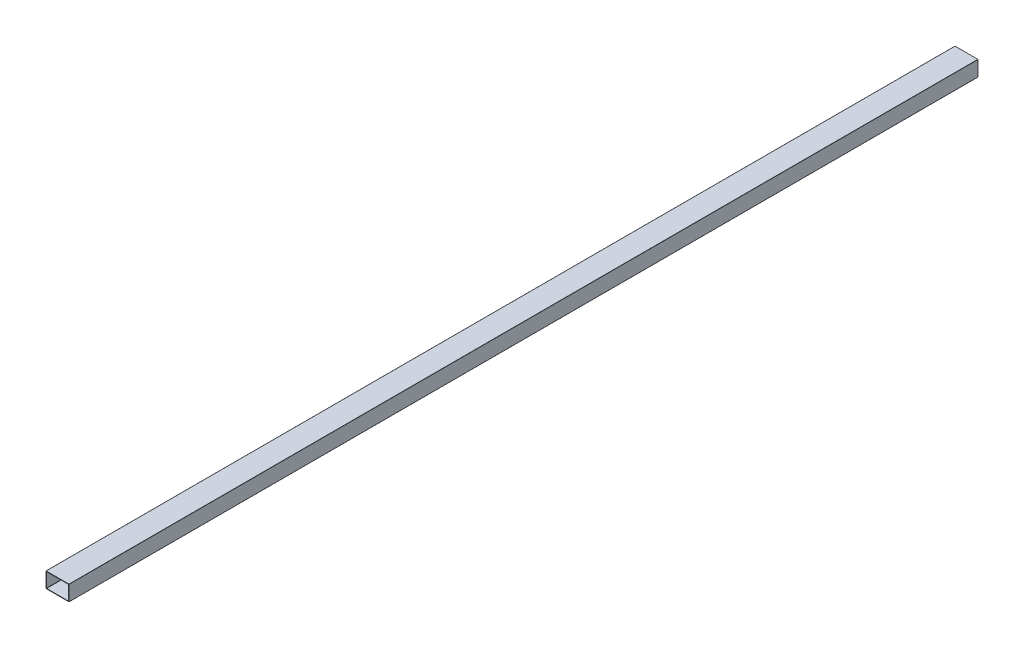
ISO-10303-21;
HEADER;
FILE_DESCRIPTION(('STEP AP214'),'2;1');
FILE_NAME('part.step','',(''),(''),'','','');
FILE_SCHEMA(('AUTOMOTIVE_DESIGN { 1 0 10303 214 1 1 1 1 }'));
ENDSEC;
DATA;
#1=APPLICATION_CONTEXT('core data for automotive mechanical design processes');
#2=APPLICATION_PROTOCOL_DEFINITION('international standard','automotive_design',2000,#1);
#3=PRODUCT_CONTEXT('',#1,'mechanical');
#4=PRODUCT('Part','Part','',(#3));
#5=PRODUCT_RELATED_PRODUCT_CATEGORY('part','',(#4));
#6=PRODUCT_DEFINITION_FORMATION('','',#4);
#7=PRODUCT_DEFINITION_CONTEXT('part definition',#1,'design');
#8=PRODUCT_DEFINITION('design','',#6,#7);
#9=PRODUCT_DEFINITION_SHAPE('','',#8);
#10=(LENGTH_UNIT() NAMED_UNIT(*) SI_UNIT(.MILLI.,.METRE.));
#11=(NAMED_UNIT(*) PLANE_ANGLE_UNIT() SI_UNIT($,.RADIAN.));
#12=(NAMED_UNIT(*) SI_UNIT($,.STERADIAN.) SOLID_ANGLE_UNIT());
#13=UNCERTAINTY_MEASURE_WITH_UNIT(LENGTH_MEASURE(1.E-05),#10,'distance_accuracy_value','');
#14=(GEOMETRIC_REPRESENTATION_CONTEXT(3) GLOBAL_UNCERTAINTY_ASSIGNED_CONTEXT((#13)) GLOBAL_UNIT_ASSIGNED_CONTEXT((#10,
#11,#12)) REPRESENTATION_CONTEXT('',''));
#15=CARTESIAN_POINT('',(0.,0.,0.));
#16=DIRECTION('',(0.,0.,1.));
#17=DIRECTION('',(1.,0.,0.));
#18=AXIS2_PLACEMENT_3D('',#15,#16,#17);
#19=CARTESIAN_POINT('',(76.2,-50.8,-6000.));
#20=DIRECTION('',(1.,0.,0.));
#21=DIRECTION('',(0.,0.,-1.));
#22=AXIS2_PLACEMENT_3D('',#19,#20,#21);
#23=PLANE('',#22);
#24=DIRECTION('',(0.,1.,0.));
#25=VECTOR('',#24,1.);
#26=CARTESIAN_POINT('',(76.2,-50.8,0.));
#27=LINE('',#26,#25);
#28=CARTESIAN_POINT('',(76.2,-49.8,0.));
#29=VERTEX_POINT('',#28);
#30=CARTESIAN_POINT('',(76.2,49.8,0.));
#31=VERTEX_POINT('',#30);
#32=EDGE_CURVE('E197',#29,#31,#27,.T.);
#33=ORIENTED_EDGE('',*,*,#32,.F.);
#34=DIRECTION('',(0.,0.,1.));
#35=VECTOR('',#34,1.);
#36=CARTESIAN_POINT('',(76.2,-49.8,-6000.));
#37=LINE('',#36,#35);
#38=CARTESIAN_POINT('',(76.2,-49.8,-6000.));
#39=VERTEX_POINT('',#38);
#40=EDGE_CURVE('E158',#29,#39,#37,.F.);
#41=ORIENTED_EDGE('',*,*,#40,.T.);
#42=DIRECTION('',(0.,1.,0.));
#43=VECTOR('',#42,1.);
#44=CARTESIAN_POINT('',(76.2,-50.8,-6000.));
#45=LINE('',#44,#43);
#46=CARTESIAN_POINT('',(76.2,49.8,-6000.));
#47=VERTEX_POINT('',#46);
#48=EDGE_CURVE('E185',#39,#47,#45,.T.);
#49=ORIENTED_EDGE('',*,*,#48,.T.);
#50=DIRECTION('',(0.,0.,1.));
#51=VECTOR('',#50,1.);
#52=CARTESIAN_POINT('',(76.2,49.8,-6000.));
#53=LINE('',#52,#51);
#54=EDGE_CURVE('E251',#47,#31,#53,.T.);
#55=ORIENTED_EDGE('',*,*,#54,.T.);
#56=EDGE_LOOP('',(#33,#41,#49,#55));
#57=FACE_BOUND('',#56,.T.);
#58=ADVANCED_FACE('F33',(#57),#23,.T.);
#59=CARTESIAN_POINT('',(-76.2,-50.8,-6000.));
#60=DIRECTION('',(0.,-1.,0.));
#61=DIRECTION('',(0.,0.,-1.));
#62=AXIS2_PLACEMENT_3D('',#59,#60,#61);
#63=PLANE('',#62);
#64=DIRECTION('',(1.,0.,0.));
#65=VECTOR('',#64,1.);
#66=CARTESIAN_POINT('',(-76.2,-50.8,0.));
#67=LINE('',#66,#65);
#68=CARTESIAN_POINT('',(-75.2,-50.8,0.));
#69=VERTEX_POINT('',#68);
#70=CARTESIAN_POINT('',(75.2,-50.8,0.));
#71=VERTEX_POINT('',#70);
#72=EDGE_CURVE('E189',#69,#71,#67,.T.);
#73=ORIENTED_EDGE('',*,*,#72,.F.);
#74=DIRECTION('',(0.,0.,1.));
#75=VECTOR('',#74,1.);
#76=CARTESIAN_POINT('',(-75.2,-50.8,-6000.));
#77=LINE('',#76,#75);
#78=CARTESIAN_POINT('',(-75.2,-50.8,-6000.));
#79=VERTEX_POINT('',#78);
#80=EDGE_CURVE('E238',#69,#79,#77,.F.);
#81=ORIENTED_EDGE('',*,*,#80,.T.);
#82=DIRECTION('',(1.,0.,0.));
#83=VECTOR('',#82,1.);
#84=CARTESIAN_POINT('',(-76.2,-50.8,-6000.));
#85=LINE('',#84,#83);
#86=CARTESIAN_POINT('',(75.2,-50.8,-6000.));
#87=VERTEX_POINT('',#86);
#88=EDGE_CURVE('E194',#79,#87,#85,.T.);
#89=ORIENTED_EDGE('',*,*,#88,.T.);
#90=DIRECTION('',(0.,0.,1.));
#91=VECTOR('',#90,1.);
#92=CARTESIAN_POINT('',(75.2,-50.8,-6000.));
#93=LINE('',#92,#91);
#94=EDGE_CURVE('E235',#87,#71,#93,.T.);
#95=ORIENTED_EDGE('',*,*,#94,.T.);
#96=EDGE_LOOP('',(#73,#81,#89,#95));
#97=FACE_BOUND('',#96,.T.);
#98=ADVANCED_FACE('F305',(#97),#63,.T.);
#99=CARTESIAN_POINT('',(-76.2,-50.8,-6000.));
#100=DIRECTION('',(-1.,0.,0.));
#101=DIRECTION('',(0.,0.,1.));
#102=AXIS2_PLACEMENT_3D('',#99,#100,#101);
#103=PLANE('',#102);
#104=DIRECTION('',(0.,-1.,0.));
#105=VECTOR('',#104,1.);
#106=CARTESIAN_POINT('',(-76.2,-50.8,-6000.));
#107=LINE('',#106,#105);
#108=CARTESIAN_POINT('',(-76.2,49.8,-6000.));
#109=VERTEX_POINT('',#108);
#110=CARTESIAN_POINT('',(-76.2,-49.8,-6000.));
#111=VERTEX_POINT('',#110);
#112=EDGE_CURVE('E191',#109,#111,#107,.T.);
#113=ORIENTED_EDGE('',*,*,#112,.T.);
#114=DIRECTION('',(0.,0.,1.));
#115=VECTOR('',#114,1.);
#116=CARTESIAN_POINT('',(-76.2,-49.8,-6000.));
#117=LINE('',#116,#115);
#118=CARTESIAN_POINT('',(-76.2,-49.8,0.));
#119=VERTEX_POINT('',#118);
#120=EDGE_CURVE('E224',#111,#119,#117,.T.);
#121=ORIENTED_EDGE('',*,*,#120,.T.);
#122=DIRECTION('',(0.,-1.,0.));
#123=VECTOR('',#122,1.);
#124=CARTESIAN_POINT('',(-76.2,-50.8,0.));
#125=LINE('',#124,#123);
#126=CARTESIAN_POINT('',(-76.2,49.8,0.));
#127=VERTEX_POINT('',#126);
#128=EDGE_CURVE('E203',#127,#119,#125,.T.);
#129=ORIENTED_EDGE('',*,*,#128,.F.);
#130=DIRECTION('',(0.,0.,1.));
#131=VECTOR('',#130,1.);
#132=CARTESIAN_POINT('',(-76.2,49.8,-6000.));
#133=LINE('',#132,#131);
#134=EDGE_CURVE('E222',#127,#109,#133,.F.);
#135=ORIENTED_EDGE('',*,*,#134,.T.);
#136=EDGE_LOOP('',(#113,#121,#129,#135));
#137=FACE_BOUND('',#136,.T.);
#138=ADVANCED_FACE('F311',(#137),#103,.T.);
#139=CARTESIAN_POINT('',(-76.2,50.8,-6000.));
#140=DIRECTION('',(0.,1.,0.));
#141=DIRECTION('',(0.,0.,1.));
#142=AXIS2_PLACEMENT_3D('',#139,#140,#141);
#143=PLANE('',#142);
#144=DIRECTION('',(-1.,0.,0.));
#145=VECTOR('',#144,1.);
#146=CARTESIAN_POINT('',(-76.2,50.8,-6000.));
#147=LINE('',#146,#145);
#148=CARTESIAN_POINT('',(75.2,50.8,-6000.));
#149=VERTEX_POINT('',#148);
#150=CARTESIAN_POINT('',(-75.2,50.8,-6000.));
#151=VERTEX_POINT('',#150);
#152=EDGE_CURVE('E188',#149,#151,#147,.T.);
#153=ORIENTED_EDGE('',*,*,#152,.T.);
#154=DIRECTION('',(0.,0.,1.));
#155=VECTOR('',#154,1.);
#156=CARTESIAN_POINT('',(-75.2,50.8,-6000.));
#157=LINE('',#156,#155);
#158=CARTESIAN_POINT('',(-75.2,50.8,0.));
#159=VERTEX_POINT('',#158);
#160=EDGE_CURVE('E248',#151,#159,#157,.T.);
#161=ORIENTED_EDGE('',*,*,#160,.T.);
#162=DIRECTION('',(-1.,0.,0.));
#163=VECTOR('',#162,1.);
#164=CARTESIAN_POINT('',(-76.2,50.8,0.));
#165=LINE('',#164,#163);
#166=CARTESIAN_POINT('',(75.2,50.8,0.));
#167=VERTEX_POINT('',#166);
#168=EDGE_CURVE('E200',#167,#159,#165,.T.);
#169=ORIENTED_EDGE('',*,*,#168,.F.);
#170=DIRECTION('',(0.,0.,1.));
#171=VECTOR('',#170,1.);
#172=CARTESIAN_POINT('',(75.2,50.8,-6000.));
#173=LINE('',#172,#171);
#174=EDGE_CURVE('E55',#167,#149,#173,.F.);
#175=ORIENTED_EDGE('',*,*,#174,.T.);
#176=EDGE_LOOP('',(#153,#161,#169,#175));
#177=FACE_BOUND('',#176,.T.);
#178=ADVANCED_FACE('F316',(#177),#143,.T.);
#179=CARTESIAN_POINT('',(0.,0.,-6000.));
#180=DIRECTION('',(0.,0.,-1.));
#181=DIRECTION('',(-1.,0.,0.));
#182=AXIS2_PLACEMENT_3D('',#179,#180,#181);
#183=PLANE('',#182);
#184=DIRECTION('',(0.,-1.,0.));
#185=VECTOR('',#184,1.);
#186=CARTESIAN_POINT('',(-73.16,-47.76,-6000.));
#187=LINE('',#186,#185);
#188=CARTESIAN_POINT('',(-73.16,46.76,-6000.));
#189=VERTEX_POINT('',#188);
#190=CARTESIAN_POINT('',(-73.16,-46.76,-6000.));
#191=VERTEX_POINT('',#190);
#192=EDGE_CURVE('E167',#189,#191,#187,.T.);
#193=ORIENTED_EDGE('',*,*,#192,.T.);
#194=CARTESIAN_POINT('',(-72.16,-46.76,-6000.));
#195=DIRECTION('',(0.,0.,-1.));
#196=DIRECTION('',(-1.,0.,0.));
#197=AXIS2_PLACEMENT_3D('',#194,#195,#196);
#198=CIRCLE('',#197,1.);
#199=CARTESIAN_POINT('',(-72.16,-47.76,-6000.));
#200=VERTEX_POINT('',#199);
#201=EDGE_CURVE('E11',#191,#200,#198,.F.);
#202=ORIENTED_EDGE('',*,*,#201,.T.);
#203=DIRECTION('',(1.,0.,0.));
#204=VECTOR('',#203,1.);
#205=CARTESIAN_POINT('',(-73.16,-47.76,-6000.));
#206=LINE('',#205,#204);
#207=CARTESIAN_POINT('',(72.16,-47.76,-6000.));
#208=VERTEX_POINT('',#207);
#209=EDGE_CURVE('E175',#200,#208,#206,.T.);
#210=ORIENTED_EDGE('',*,*,#209,.T.);
#211=CARTESIAN_POINT('',(72.16,-46.76,-6000.));
#212=DIRECTION('',(0.,0.,-1.));
#213=DIRECTION('',(-1.,0.,0.));
#214=AXIS2_PLACEMENT_3D('',#211,#212,#213);
#215=CIRCLE('',#214,1.);
#216=CARTESIAN_POINT('',(73.16,-46.76,-6000.));
#217=VERTEX_POINT('',#216);
#218=EDGE_CURVE('E262',#208,#217,#215,.F.);
#219=ORIENTED_EDGE('',*,*,#218,.T.);
#220=DIRECTION('',(0.,1.,0.));
#221=VECTOR('',#220,1.);
#222=CARTESIAN_POINT('',(73.16,-47.76,-6000.));
#223=LINE('',#222,#221);
#224=CARTESIAN_POINT('',(73.16,46.76,-6000.));
#225=VERTEX_POINT('',#224);
#226=EDGE_CURVE('E179',#217,#225,#223,.T.);
#227=ORIENTED_EDGE('',*,*,#226,.T.);
#228=CARTESIAN_POINT('',(72.16,46.76,-6000.));
#229=DIRECTION('',(0.,0.,-1.));
#230=DIRECTION('',(-1.,0.,0.));
#231=AXIS2_PLACEMENT_3D('',#228,#229,#230);
#232=CIRCLE('',#231,1.);
#233=CARTESIAN_POINT('',(72.16,47.76,-6000.));
#234=VERTEX_POINT('',#233);
#235=EDGE_CURVE('E258',#225,#234,#232,.F.);
#236=ORIENTED_EDGE('',*,*,#235,.T.);
#237=DIRECTION('',(-1.,0.,0.));
#238=VECTOR('',#237,1.);
#239=CARTESIAN_POINT('',(-73.16,47.76,-6000.));
#240=LINE('',#239,#238);
#241=CARTESIAN_POINT('',(-72.16,47.76,-6000.));
#242=VERTEX_POINT('',#241);
#243=EDGE_CURVE('E277',#234,#242,#240,.T.);
#244=ORIENTED_EDGE('',*,*,#243,.T.);
#245=CARTESIAN_POINT('',(-72.16,46.76,-6000.));
#246=DIRECTION('',(0.,0.,-1.));
#247=DIRECTION('',(-1.,0.,0.));
#248=AXIS2_PLACEMENT_3D('',#245,#246,#247);
#249=CIRCLE('',#248,1.);
#250=EDGE_CURVE('E157',#242,#189,#249,.F.);
#251=ORIENTED_EDGE('',*,*,#250,.T.);
#252=EDGE_LOOP('',(#193,#202,#210,#219,#227,#236,#244,#251));
#253=FACE_BOUND('',#252,.T.);
#254=ORIENTED_EDGE('',*,*,#88,.F.);
#255=CARTESIAN_POINT('',(-75.2,-49.8,-6000.));
#256=DIRECTION('',(0.,0.,-1.));
#257=DIRECTION('',(-1.,0.,0.));
#258=AXIS2_PLACEMENT_3D('',#255,#256,#257);
#259=CIRCLE('',#258,1.);
#260=EDGE_CURVE('E245',#79,#111,#259,.T.);
#261=ORIENTED_EDGE('',*,*,#260,.T.);
#262=ORIENTED_EDGE('',*,*,#112,.F.);
#263=CARTESIAN_POINT('',(-75.2,49.8,-6000.));
#264=DIRECTION('',(0.,0.,-1.));
#265=DIRECTION('',(-1.,0.,0.));
#266=AXIS2_PLACEMENT_3D('',#263,#264,#265);
#267=CIRCLE('',#266,1.);
#268=EDGE_CURVE('E48',#109,#151,#267,.T.);
#269=ORIENTED_EDGE('',*,*,#268,.T.);
#270=ORIENTED_EDGE('',*,*,#152,.F.);
#271=CARTESIAN_POINT('',(75.2,49.8,-6000.));
#272=DIRECTION('',(0.,0.,-1.));
#273=DIRECTION('',(-1.,0.,0.));
#274=AXIS2_PLACEMENT_3D('',#271,#272,#273);
#275=CIRCLE('',#274,1.);
#276=EDGE_CURVE('E240',#149,#47,#275,.T.);
#277=ORIENTED_EDGE('',*,*,#276,.T.);
#278=ORIENTED_EDGE('',*,*,#48,.F.);
#279=CARTESIAN_POINT('',(75.2,-49.8,-6000.));
#280=DIRECTION('',(0.,0.,-1.));
#281=DIRECTION('',(-1.,0.,0.));
#282=AXIS2_PLACEMENT_3D('',#279,#280,#281);
#283=CIRCLE('',#282,1.);
#284=EDGE_CURVE('E242',#39,#87,#283,.T.);
#285=ORIENTED_EDGE('',*,*,#284,.T.);
#286=EDGE_LOOP('',(#254,#261,#262,#269,#270,#277,#278,#285));
#287=FACE_BOUND('',#286,.T.);
#288=ADVANCED_FACE('F267',(#253,#287),#183,.T.);
#289=CARTESIAN_POINT('',(0.,0.,0.));
#290=DIRECTION('',(0.,0.,-1.));
#291=DIRECTION('',(-1.,0.,0.));
#292=AXIS2_PLACEMENT_3D('',#289,#290,#291);
#293=PLANE('',#292);
#294=DIRECTION('',(0.,1.,0.));
#295=VECTOR('',#294,1.);
#296=CARTESIAN_POINT('',(73.16,-47.76,0.));
#297=LINE('',#296,#295);
#298=CARTESIAN_POINT('',(73.16,-46.76,0.));
#299=VERTEX_POINT('',#298);
#300=CARTESIAN_POINT('',(73.16,46.76,0.));
#301=VERTEX_POINT('',#300);
#302=EDGE_CURVE('E181',#299,#301,#297,.T.);
#303=ORIENTED_EDGE('',*,*,#302,.F.);
#304=CARTESIAN_POINT('',(72.16,-46.76,0.));
#305=DIRECTION('',(0.,0.,-1.));
#306=DIRECTION('',(-1.,0.,0.));
#307=AXIS2_PLACEMENT_3D('',#304,#305,#306);
#308=CIRCLE('',#307,1.);
#309=CARTESIAN_POINT('',(72.16,-47.76,0.));
#310=VERTEX_POINT('',#309);
#311=EDGE_CURVE('E260',#299,#310,#308,.T.);
#312=ORIENTED_EDGE('',*,*,#311,.T.);
#313=DIRECTION('',(1.,0.,0.));
#314=VECTOR('',#313,1.);
#315=CARTESIAN_POINT('',(-73.16,-47.76,0.));
#316=LINE('',#315,#314);
#317=CARTESIAN_POINT('',(-72.16,-47.76,0.));
#318=VERTEX_POINT('',#317);
#319=EDGE_CURVE('E281',#318,#310,#316,.T.);
#320=ORIENTED_EDGE('',*,*,#319,.F.);
#321=CARTESIAN_POINT('',(-72.16,-46.76,0.));
#322=DIRECTION('',(0.,0.,-1.));
#323=DIRECTION('',(-1.,0.,0.));
#324=AXIS2_PLACEMENT_3D('',#321,#322,#323);
#325=CIRCLE('',#324,1.);
#326=CARTESIAN_POINT('',(-73.16,-46.76,0.));
#327=VERTEX_POINT('',#326);
#328=EDGE_CURVE('E41',#318,#327,#325,.T.);
#329=ORIENTED_EDGE('',*,*,#328,.T.);
#330=DIRECTION('',(0.,-1.,0.));
#331=VECTOR('',#330,1.);
#332=CARTESIAN_POINT('',(-73.16,-47.76,0.));
#333=LINE('',#332,#331);
#334=CARTESIAN_POINT('',(-73.16,46.76,0.));
#335=VERTEX_POINT('',#334);
#336=EDGE_CURVE('E164',#335,#327,#333,.T.);
#337=ORIENTED_EDGE('',*,*,#336,.F.);
#338=CARTESIAN_POINT('',(-72.16,46.76,0.));
#339=DIRECTION('',(0.,0.,-1.));
#340=DIRECTION('',(-1.,0.,0.));
#341=AXIS2_PLACEMENT_3D('',#338,#339,#340);
#342=CIRCLE('',#341,1.);
#343=CARTESIAN_POINT('',(-72.16,47.76,0.));
#344=VERTEX_POINT('',#343);
#345=EDGE_CURVE('E147',#335,#344,#342,.T.);
#346=ORIENTED_EDGE('',*,*,#345,.T.);
#347=DIRECTION('',(-1.,0.,0.));
#348=VECTOR('',#347,1.);
#349=CARTESIAN_POINT('',(-73.16,47.76,0.));
#350=LINE('',#349,#348);
#351=CARTESIAN_POINT('',(72.16,47.76,0.));
#352=VERTEX_POINT('',#351);
#353=EDGE_CURVE('E176',#352,#344,#350,.T.);
#354=ORIENTED_EDGE('',*,*,#353,.F.);
#355=CARTESIAN_POINT('',(72.16,46.76,0.));
#356=DIRECTION('',(0.,0.,-1.));
#357=DIRECTION('',(-1.,0.,0.));
#358=AXIS2_PLACEMENT_3D('',#355,#356,#357);
#359=CIRCLE('',#358,1.);
#360=EDGE_CURVE('E256',#352,#301,#359,.T.);
#361=ORIENTED_EDGE('',*,*,#360,.T.);
#362=EDGE_LOOP('',(#303,#312,#320,#329,#337,#346,#354,#361));
#363=FACE_BOUND('',#362,.T.);
#364=ORIENTED_EDGE('',*,*,#128,.T.);
#365=CARTESIAN_POINT('',(-75.2,-49.8,0.));
#366=DIRECTION('',(0.,0.,-1.));
#367=DIRECTION('',(-1.,0.,0.));
#368=AXIS2_PLACEMENT_3D('',#365,#366,#367);
#369=CIRCLE('',#368,1.);
#370=EDGE_CURVE('E233',#119,#69,#369,.F.);
#371=ORIENTED_EDGE('',*,*,#370,.T.);
#372=ORIENTED_EDGE('',*,*,#72,.T.);
#373=CARTESIAN_POINT('',(75.2,-49.8,0.));
#374=DIRECTION('',(0.,0.,-1.));
#375=DIRECTION('',(-1.,0.,0.));
#376=AXIS2_PLACEMENT_3D('',#373,#374,#375);
#377=CIRCLE('',#376,1.);
#378=EDGE_CURVE('E229',#71,#29,#377,.F.);
#379=ORIENTED_EDGE('',*,*,#378,.T.);
#380=ORIENTED_EDGE('',*,*,#32,.T.);
#381=CARTESIAN_POINT('',(75.2,49.8,0.));
#382=DIRECTION('',(0.,0.,-1.));
#383=DIRECTION('',(-1.,0.,0.));
#384=AXIS2_PLACEMENT_3D('',#381,#382,#383);
#385=CIRCLE('',#384,1.);
#386=EDGE_CURVE('E227',#31,#167,#385,.F.);
#387=ORIENTED_EDGE('',*,*,#386,.T.);
#388=ORIENTED_EDGE('',*,*,#168,.T.);
#389=CARTESIAN_POINT('',(-75.2,49.8,0.));
#390=DIRECTION('',(0.,0.,-1.));
#391=DIRECTION('',(-1.,0.,0.));
#392=AXIS2_PLACEMENT_3D('',#389,#390,#391);
#393=CIRCLE('',#392,1.);
#394=EDGE_CURVE('E231',#159,#127,#393,.F.);
#395=ORIENTED_EDGE('',*,*,#394,.T.);
#396=EDGE_LOOP('',(#364,#371,#372,#379,#380,#387,#388,#395));
#397=FACE_BOUND('',#396,.T.);
#398=ADVANCED_FACE('F172',(#363,#397),#293,.F.);
#399=CARTESIAN_POINT('',(-73.16,-47.76,-6000.));
#400=DIRECTION('',(0.,-1.,0.));
#401=DIRECTION('',(0.,0.,-1.));
#402=AXIS2_PLACEMENT_3D('',#399,#400,#401);
#403=PLANE('',#402);
#404=ORIENTED_EDGE('',*,*,#319,.T.);
#405=DIRECTION('',(0.,0.,1.));
#406=VECTOR('',#405,1.);
#407=CARTESIAN_POINT('',(72.16,-47.76,-6000.));
#408=LINE('',#407,#406);
#409=EDGE_CURVE('E220',#310,#208,#408,.F.);
#410=ORIENTED_EDGE('',*,*,#409,.T.);
#411=ORIENTED_EDGE('',*,*,#209,.F.);
#412=DIRECTION('',(0.,0.,1.));
#413=VECTOR('',#412,1.);
#414=CARTESIAN_POINT('',(-72.16,-47.76,0.));
#415=LINE('',#414,#413);
#416=EDGE_CURVE('E217',#200,#318,#415,.T.);
#417=ORIENTED_EDGE('',*,*,#416,.T.);
#418=EDGE_LOOP('',(#404,#410,#411,#417));
#419=FACE_BOUND('',#418,.T.);
#420=ADVANCED_FACE('F283',(#419),#403,.F.);
#421=CARTESIAN_POINT('',(-73.16,-47.76,-6000.));
#422=DIRECTION('',(-1.,0.,0.));
#423=DIRECTION('',(0.,0.,1.));
#424=AXIS2_PLACEMENT_3D('',#421,#422,#423);
#425=PLANE('',#424);
#426=ORIENTED_EDGE('',*,*,#192,.F.);
#427=DIRECTION('',(0.,0.,1.));
#428=VECTOR('',#427,1.);
#429=CARTESIAN_POINT('',(-73.16,46.76,0.));
#430=LINE('',#429,#428);
#431=EDGE_CURVE('E151',#189,#335,#430,.T.);
#432=ORIENTED_EDGE('',*,*,#431,.T.);
#433=ORIENTED_EDGE('',*,*,#336,.T.);
#434=DIRECTION('',(0.,0.,1.));
#435=VECTOR('',#434,1.);
#436=CARTESIAN_POINT('',(-73.16,-46.76,-6000.));
#437=LINE('',#436,#435);
#438=EDGE_CURVE('E169',#327,#191,#437,.F.);
#439=ORIENTED_EDGE('',*,*,#438,.T.);
#440=EDGE_LOOP('',(#426,#432,#433,#439));
#441=FACE_BOUND('',#440,.T.);
#442=ADVANCED_FACE('F163',(#441),#425,.F.);
#443=CARTESIAN_POINT('',(-73.16,47.76,-6000.));
#444=DIRECTION('',(0.,1.,0.));
#445=DIRECTION('',(-1.,0.,0.));
#446=AXIS2_PLACEMENT_3D('',#443,#444,#445);
#447=PLANE('',#446);
#448=ORIENTED_EDGE('',*,*,#353,.T.);
#449=DIRECTION('',(0.,0.,1.));
#450=VECTOR('',#449,1.);
#451=CARTESIAN_POINT('',(-72.16,47.76,-6000.));
#452=LINE('',#451,#450);
#453=EDGE_CURVE('E152',#344,#242,#452,.F.);
#454=ORIENTED_EDGE('',*,*,#453,.T.);
#455=ORIENTED_EDGE('',*,*,#243,.F.);
#456=DIRECTION('',(0.,0.,1.));
#457=VECTOR('',#456,1.);
#458=CARTESIAN_POINT('',(72.16,47.76,0.));
#459=LINE('',#458,#457);
#460=EDGE_CURVE('E168',#234,#352,#459,.T.);
#461=ORIENTED_EDGE('',*,*,#460,.T.);
#462=EDGE_LOOP('',(#448,#454,#455,#461));
#463=FACE_BOUND('',#462,.T.);
#464=ADVANCED_FACE('F292',(#463),#447,.F.);
#465=CARTESIAN_POINT('',(73.16,-47.76,-6000.));
#466=DIRECTION('',(1.,0.,0.));
#467=DIRECTION('',(0.,1.,0.));
#468=AXIS2_PLACEMENT_3D('',#465,#466,#467);
#469=PLANE('',#468);
#470=ORIENTED_EDGE('',*,*,#302,.T.);
#471=DIRECTION('',(0.,0.,1.));
#472=VECTOR('',#471,1.);
#473=CARTESIAN_POINT('',(73.16,46.76,-6000.));
#474=LINE('',#473,#472);
#475=EDGE_CURVE('E215',#301,#225,#474,.F.);
#476=ORIENTED_EDGE('',*,*,#475,.T.);
#477=ORIENTED_EDGE('',*,*,#226,.F.);
#478=DIRECTION('',(0.,0.,1.));
#479=VECTOR('',#478,1.);
#480=CARTESIAN_POINT('',(73.16,-46.76,0.));
#481=LINE('',#480,#479);
#482=EDGE_CURVE('E212',#217,#299,#481,.T.);
#483=ORIENTED_EDGE('',*,*,#482,.T.);
#484=EDGE_LOOP('',(#470,#476,#477,#483));
#485=FACE_BOUND('',#484,.T.);
#486=ADVANCED_FACE('F275',(#485),#469,.F.);
#487=CARTESIAN_POINT('',(-72.16,46.76,-6000.));
#488=DIRECTION('',(0.,0.,-1.));
#489=DIRECTION('',(-1.,0.,0.));
#490=AXIS2_PLACEMENT_3D('',#487,#488,#489);
#491=CYLINDRICAL_SURFACE('',#490,1.);
#492=ORIENTED_EDGE('',*,*,#250,.F.);
#493=ORIENTED_EDGE('',*,*,#453,.F.);
#494=ORIENTED_EDGE('',*,*,#345,.F.);
#495=ORIENTED_EDGE('',*,*,#431,.F.);
#496=EDGE_LOOP('',(#492,#493,#494,#495));
#497=FACE_BOUND('',#496,.T.);
#498=ADVANCED_FACE('F150',(#497),#491,.F.);
#499=CARTESIAN_POINT('',(72.16,46.76,-6000.));
#500=DIRECTION('',(0.,0.,-1.));
#501=DIRECTION('',(-1.,0.,0.));
#502=AXIS2_PLACEMENT_3D('',#499,#500,#501);
#503=CYLINDRICAL_SURFACE('',#502,1.);
#504=ORIENTED_EDGE('',*,*,#235,.F.);
#505=ORIENTED_EDGE('',*,*,#475,.F.);
#506=ORIENTED_EDGE('',*,*,#360,.F.);
#507=ORIENTED_EDGE('',*,*,#460,.F.);
#508=EDGE_LOOP('',(#504,#505,#506,#507));
#509=FACE_BOUND('',#508,.T.);
#510=ADVANCED_FACE('F294',(#509),#503,.F.);
#511=CARTESIAN_POINT('',(72.16,-46.76,-6000.));
#512=DIRECTION('',(0.,0.,-1.));
#513=DIRECTION('',(-1.,0.,0.));
#514=AXIS2_PLACEMENT_3D('',#511,#512,#513);
#515=CYLINDRICAL_SURFACE('',#514,1.);
#516=ORIENTED_EDGE('',*,*,#218,.F.);
#517=ORIENTED_EDGE('',*,*,#409,.F.);
#518=ORIENTED_EDGE('',*,*,#311,.F.);
#519=ORIENTED_EDGE('',*,*,#482,.F.);
#520=EDGE_LOOP('',(#516,#517,#518,#519));
#521=FACE_BOUND('',#520,.T.);
#522=ADVANCED_FACE('F279',(#521),#515,.F.);
#523=CARTESIAN_POINT('',(-75.2,-49.8,-6000.));
#524=DIRECTION('',(0.,0.,1.));
#525=DIRECTION('',(1.,0.,0.));
#526=AXIS2_PLACEMENT_3D('',#523,#524,#525);
#527=CYLINDRICAL_SURFACE('',#526,1.);
#528=ORIENTED_EDGE('',*,*,#260,.F.);
#529=ORIENTED_EDGE('',*,*,#80,.F.);
#530=ORIENTED_EDGE('',*,*,#370,.F.);
#531=ORIENTED_EDGE('',*,*,#120,.F.);
#532=EDGE_LOOP('',(#528,#529,#530,#531));
#533=FACE_BOUND('',#532,.T.);
#534=ADVANCED_FACE('F301',(#533),#527,.T.);
#535=CARTESIAN_POINT('',(-75.2,49.8,-6000.));
#536=DIRECTION('',(0.,0.,1.));
#537=DIRECTION('',(1.,0.,0.));
#538=AXIS2_PLACEMENT_3D('',#535,#536,#537);
#539=CYLINDRICAL_SURFACE('',#538,1.);
#540=ORIENTED_EDGE('',*,*,#268,.F.);
#541=ORIENTED_EDGE('',*,*,#134,.F.);
#542=ORIENTED_EDGE('',*,*,#394,.F.);
#543=ORIENTED_EDGE('',*,*,#160,.F.);
#544=EDGE_LOOP('',(#540,#541,#542,#543));
#545=FACE_BOUND('',#544,.T.);
#546=ADVANCED_FACE('F368',(#545),#539,.T.);
#547=CARTESIAN_POINT('',(-72.16,-46.76,-6000.));
#548=DIRECTION('',(0.,0.,-1.));
#549=DIRECTION('',(-1.,0.,0.));
#550=AXIS2_PLACEMENT_3D('',#547,#548,#549);
#551=CYLINDRICAL_SURFACE('',#550,1.);
#552=ORIENTED_EDGE('',*,*,#201,.F.);
#553=ORIENTED_EDGE('',*,*,#438,.F.);
#554=ORIENTED_EDGE('',*,*,#328,.F.);
#555=ORIENTED_EDGE('',*,*,#416,.F.);
#556=EDGE_LOOP('',(#552,#553,#554,#555));
#557=FACE_BOUND('',#556,.T.);
#558=ADVANCED_FACE('F378',(#557),#551,.F.);
#559=CARTESIAN_POINT('',(75.2,-49.8,-6000.));
#560=DIRECTION('',(0.,0.,1.));
#561=DIRECTION('',(1.,0.,0.));
#562=AXIS2_PLACEMENT_3D('',#559,#560,#561);
#563=CYLINDRICAL_SURFACE('',#562,1.);
#564=ORIENTED_EDGE('',*,*,#284,.F.);
#565=ORIENTED_EDGE('',*,*,#40,.F.);
#566=ORIENTED_EDGE('',*,*,#378,.F.);
#567=ORIENTED_EDGE('',*,*,#94,.F.);
#568=EDGE_LOOP('',(#564,#565,#566,#567));
#569=FACE_BOUND('',#568,.T.);
#570=ADVANCED_FACE('F388',(#569),#563,.T.);
#571=CARTESIAN_POINT('',(75.2,49.8,-6000.));
#572=DIRECTION('',(0.,0.,1.));
#573=DIRECTION('',(1.,0.,0.));
#574=AXIS2_PLACEMENT_3D('',#571,#572,#573);
#575=CYLINDRICAL_SURFACE('',#574,1.);
#576=ORIENTED_EDGE('',*,*,#276,.F.);
#577=ORIENTED_EDGE('',*,*,#174,.F.);
#578=ORIENTED_EDGE('',*,*,#386,.F.);
#579=ORIENTED_EDGE('',*,*,#54,.F.);
#580=EDGE_LOOP('',(#576,#577,#578,#579));
#581=FACE_BOUND('',#580,.T.);
#582=ADVANCED_FACE('F35',(#581),#575,.T.);
#583=CLOSED_SHELL('',(#58,#98,#138,#178,#288,#398,#420,#442,#464,#486,#498,#510,#522,#534,#546,
#558,#570,#582));
#584=MANIFOLD_SOLID_BREP('B2',#583);
#585=ADVANCED_BREP_SHAPE_REPRESENTATION('',(#18,#584),#14);
#586=SHAPE_DEFINITION_REPRESENTATION(#9,#585);
ENDSEC;
END-ISO-10303-21;
